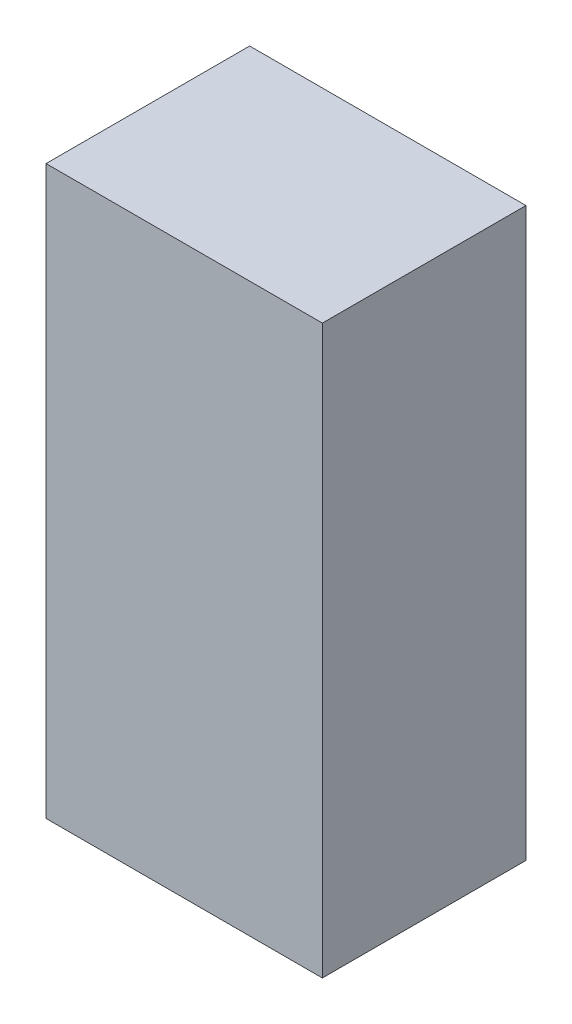
ISO-10303-21;
HEADER;
FILE_DESCRIPTION(('STEP AP214'),'2;1');
FILE_NAME('part.step','',(''),(''),'','','');
FILE_SCHEMA(('AUTOMOTIVE_DESIGN { 1 0 10303 214 1 1 1 1 }'));
ENDSEC;
DATA;
#1=APPLICATION_CONTEXT('core data for automotive mechanical design processes');
#2=APPLICATION_PROTOCOL_DEFINITION('international standard','automotive_design',2000,#1);
#3=PRODUCT_CONTEXT('',#1,'mechanical');
#4=PRODUCT('Part','Part','',(#3));
#5=PRODUCT_RELATED_PRODUCT_CATEGORY('part','',(#4));
#6=PRODUCT_DEFINITION_FORMATION('','',#4);
#7=PRODUCT_DEFINITION_CONTEXT('part definition',#1,'design');
#8=PRODUCT_DEFINITION('design','',#6,#7);
#9=PRODUCT_DEFINITION_SHAPE('','',#8);
#10=(LENGTH_UNIT() NAMED_UNIT(*) SI_UNIT(.MILLI.,.METRE.));
#11=(NAMED_UNIT(*) PLANE_ANGLE_UNIT() SI_UNIT($,.RADIAN.));
#12=(NAMED_UNIT(*) SI_UNIT($,.STERADIAN.) SOLID_ANGLE_UNIT());
#13=UNCERTAINTY_MEASURE_WITH_UNIT(LENGTH_MEASURE(1.E-05),#10,'distance_accuracy_value','');
#14=(GEOMETRIC_REPRESENTATION_CONTEXT(3) GLOBAL_UNCERTAINTY_ASSIGNED_CONTEXT((#13)) GLOBAL_UNIT_ASSIGNED_CONTEXT((#10,
#11,#12)) REPRESENTATION_CONTEXT('',''));
#15=CARTESIAN_POINT('',(0.,0.,0.));
#16=DIRECTION('',(0.,0.,1.));
#17=DIRECTION('',(1.,0.,0.));
#18=AXIS2_PLACEMENT_3D('',#15,#16,#17);
#19=CARTESIAN_POINT('',(-19.,-39.,-28.));
#20=DIRECTION('',(-1.,0.,0.));
#21=DIRECTION('',(0.,0.,1.));
#22=AXIS2_PLACEMENT_3D('',#19,#20,#21);
#23=PLANE('',#22);
#24=DIRECTION('',(0.,-1.,0.));
#25=VECTOR('',#24,1.);
#26=CARTESIAN_POINT('',(-19.,-39.,0.));
#27=LINE('',#26,#25);
#28=CARTESIAN_POINT('',(-19.,39.,0.));
#29=VERTEX_POINT('',#28);
#30=CARTESIAN_POINT('',(-19.,-39.,0.));
#31=VERTEX_POINT('',#30);
#32=EDGE_CURVE('E103',#29,#31,#27,.T.);
#33=ORIENTED_EDGE('',*,*,#32,.F.);
#34=DIRECTION('',(0.,0.,1.));
#35=VECTOR('',#34,1.);
#36=CARTESIAN_POINT('',(-19.,39.,-28.));
#37=LINE('',#36,#35);
#38=CARTESIAN_POINT('',(-19.,39.,-28.));
#39=VERTEX_POINT('',#38);
#40=EDGE_CURVE('E11',#39,#29,#37,.T.);
#41=ORIENTED_EDGE('',*,*,#40,.F.);
#42=DIRECTION('',(0.,-1.,0.));
#43=VECTOR('',#42,1.);
#44=CARTESIAN_POINT('',(-19.,-39.,-28.));
#45=LINE('',#44,#43);
#46=CARTESIAN_POINT('',(-19.,-39.,-28.));
#47=VERTEX_POINT('',#46);
#48=EDGE_CURVE('E97',#39,#47,#45,.T.);
#49=ORIENTED_EDGE('',*,*,#48,.T.);
#50=DIRECTION('',(0.,0.,1.));
#51=VECTOR('',#50,1.);
#52=CARTESIAN_POINT('',(-19.,-39.,-28.));
#53=LINE('',#52,#51);
#54=EDGE_CURVE('E42',#47,#31,#53,.T.);
#55=ORIENTED_EDGE('',*,*,#54,.T.);
#56=EDGE_LOOP('',(#33,#41,#49,#55));
#57=FACE_BOUND('',#56,.T.);
#58=ADVANCED_FACE('F39',(#57),#23,.T.);
#59=CARTESIAN_POINT('',(-19.,39.,-28.));
#60=DIRECTION('',(0.,1.,0.));
#61=DIRECTION('',(0.,0.,1.));
#62=AXIS2_PLACEMENT_3D('',#59,#60,#61);
#63=PLANE('',#62);
#64=DIRECTION('',(-1.,0.,0.));
#65=VECTOR('',#64,1.);
#66=CARTESIAN_POINT('',(-19.,39.,0.));
#67=LINE('',#66,#65);
#68=CARTESIAN_POINT('',(19.,39.,0.));
#69=VERTEX_POINT('',#68);
#70=EDGE_CURVE('E99',#69,#29,#67,.T.);
#71=ORIENTED_EDGE('',*,*,#70,.F.);
#72=DIRECTION('',(0.,0.,1.));
#73=VECTOR('',#72,1.);
#74=CARTESIAN_POINT('',(19.,39.,-28.));
#75=LINE('',#74,#73);
#76=CARTESIAN_POINT('',(19.,39.,-28.));
#77=VERTEX_POINT('',#76);
#78=EDGE_CURVE('E48',#77,#69,#75,.T.);
#79=ORIENTED_EDGE('',*,*,#78,.F.);
#80=DIRECTION('',(-1.,0.,0.));
#81=VECTOR('',#80,1.);
#82=CARTESIAN_POINT('',(-19.,39.,-28.));
#83=LINE('',#82,#81);
#84=EDGE_CURVE('E94',#77,#39,#83,.T.);
#85=ORIENTED_EDGE('',*,*,#84,.T.);
#86=ORIENTED_EDGE('',*,*,#40,.T.);
#87=EDGE_LOOP('',(#71,#79,#85,#86));
#88=FACE_BOUND('',#87,.T.);
#89=ADVANCED_FACE('F113',(#88),#63,.T.);
#90=CARTESIAN_POINT('',(19.,-39.,-28.));
#91=DIRECTION('',(1.,0.,0.));
#92=DIRECTION('',(0.,0.,-1.));
#93=AXIS2_PLACEMENT_3D('',#90,#91,#92);
#94=PLANE('',#93);
#95=DIRECTION('',(0.,1.,0.));
#96=VECTOR('',#95,1.);
#97=CARTESIAN_POINT('',(19.,-39.,0.));
#98=LINE('',#97,#96);
#99=CARTESIAN_POINT('',(19.,-39.,0.));
#100=VERTEX_POINT('',#99);
#101=EDGE_CURVE('E89',#100,#69,#98,.T.);
#102=ORIENTED_EDGE('',*,*,#101,.F.);
#103=DIRECTION('',(0.,0.,1.));
#104=VECTOR('',#103,1.);
#105=CARTESIAN_POINT('',(19.,-39.,-28.));
#106=LINE('',#105,#104);
#107=CARTESIAN_POINT('',(19.,-39.,-28.));
#108=VERTEX_POINT('',#107);
#109=EDGE_CURVE('E84',#108,#100,#106,.T.);
#110=ORIENTED_EDGE('',*,*,#109,.F.);
#111=DIRECTION('',(0.,1.,0.));
#112=VECTOR('',#111,1.);
#113=CARTESIAN_POINT('',(19.,-39.,-28.));
#114=LINE('',#113,#112);
#115=EDGE_CURVE('E87',#108,#77,#114,.T.);
#116=ORIENTED_EDGE('',*,*,#115,.T.);
#117=ORIENTED_EDGE('',*,*,#78,.T.);
#118=EDGE_LOOP('',(#102,#110,#116,#117));
#119=FACE_BOUND('',#118,.T.);
#120=ADVANCED_FACE('F86',(#119),#94,.T.);
#121=CARTESIAN_POINT('',(-19.,-39.,-28.));
#122=DIRECTION('',(0.,-1.,0.));
#123=DIRECTION('',(0.,0.,-1.));
#124=AXIS2_PLACEMENT_3D('',#121,#122,#123);
#125=PLANE('',#124);
#126=DIRECTION('',(1.,0.,0.));
#127=VECTOR('',#126,1.);
#128=CARTESIAN_POINT('',(-19.,-39.,0.));
#129=LINE('',#128,#127);
#130=EDGE_CURVE('E106',#31,#100,#129,.T.);
#131=ORIENTED_EDGE('',*,*,#130,.F.);
#132=ORIENTED_EDGE('',*,*,#54,.F.);
#133=DIRECTION('',(1.,0.,0.));
#134=VECTOR('',#133,1.);
#135=CARTESIAN_POINT('',(-19.,-39.,-28.));
#136=LINE('',#135,#134);
#137=EDGE_CURVE('E93',#47,#108,#136,.T.);
#138=ORIENTED_EDGE('',*,*,#137,.T.);
#139=ORIENTED_EDGE('',*,*,#109,.T.);
#140=EDGE_LOOP('',(#131,#132,#138,#139));
#141=FACE_BOUND('',#140,.T.);
#142=ADVANCED_FACE('F96',(#141),#125,.T.);
#143=CARTESIAN_POINT('',(0.,0.,-28.));
#144=DIRECTION('',(0.,0.,-1.));
#145=DIRECTION('',(-1.,0.,0.));
#146=AXIS2_PLACEMENT_3D('',#143,#144,#145);
#147=PLANE('',#146);
#148=ORIENTED_EDGE('',*,*,#48,.F.);
#149=ORIENTED_EDGE('',*,*,#84,.F.);
#150=ORIENTED_EDGE('',*,*,#115,.F.);
#151=ORIENTED_EDGE('',*,*,#137,.F.);
#152=EDGE_LOOP('',(#148,#149,#150,#151));
#153=FACE_BOUND('',#152,.T.);
#154=ADVANCED_FACE('F92',(#153),#147,.T.);
#155=CARTESIAN_POINT('',(0.,0.,0.));
#156=DIRECTION('',(0.,0.,-1.));
#157=DIRECTION('',(-1.,0.,0.));
#158=AXIS2_PLACEMENT_3D('',#155,#156,#157);
#159=PLANE('',#158);
#160=ORIENTED_EDGE('',*,*,#32,.T.);
#161=ORIENTED_EDGE('',*,*,#130,.T.);
#162=ORIENTED_EDGE('',*,*,#101,.T.);
#163=ORIENTED_EDGE('',*,*,#70,.T.);
#164=EDGE_LOOP('',(#160,#161,#162,#163));
#165=FACE_BOUND('',#164,.T.);
#166=ADVANCED_FACE('F112',(#165),#159,.F.);
#167=CLOSED_SHELL('',(#58,#89,#120,#142,#154,#166));
#168=MANIFOLD_SOLID_BREP('B2',#167);
#169=ADVANCED_BREP_SHAPE_REPRESENTATION('',(#18,#168),#14);
#170=SHAPE_DEFINITION_REPRESENTATION(#9,#169);
ENDSEC;
END-ISO-10303-21;
